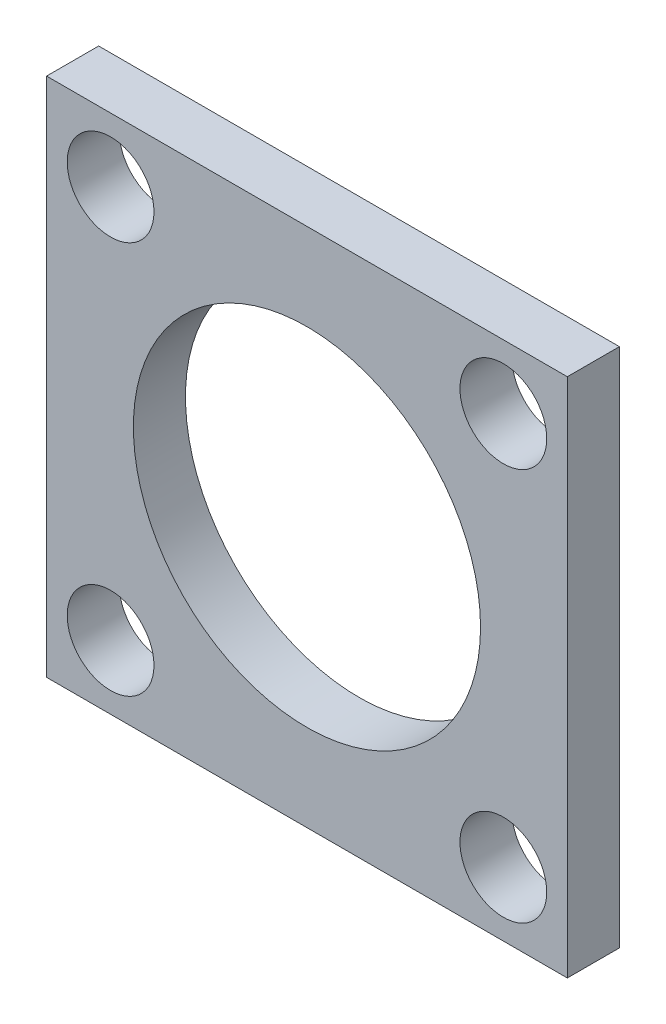
ISO-10303-21;
HEADER;
FILE_DESCRIPTION(('STEP AP214'),'2;1');
FILE_NAME('part.step','',(''),(''),'','','');
FILE_SCHEMA(('AUTOMOTIVE_DESIGN { 1 0 10303 214 1 1 1 1 }'));
ENDSEC;
DATA;
#1=APPLICATION_CONTEXT('core data for automotive mechanical design processes');
#2=APPLICATION_PROTOCOL_DEFINITION('international standard','automotive_design',2000,#1);
#3=PRODUCT_CONTEXT('',#1,'mechanical');
#4=PRODUCT('Part','Part','',(#3));
#5=PRODUCT_RELATED_PRODUCT_CATEGORY('part','',(#4));
#6=PRODUCT_DEFINITION_FORMATION('','',#4);
#7=PRODUCT_DEFINITION_CONTEXT('part definition',#1,'design');
#8=PRODUCT_DEFINITION('design','',#6,#7);
#9=PRODUCT_DEFINITION_SHAPE('','',#8);
#10=(LENGTH_UNIT() NAMED_UNIT(*) SI_UNIT(.MILLI.,.METRE.));
#11=(NAMED_UNIT(*) PLANE_ANGLE_UNIT() SI_UNIT($,.RADIAN.));
#12=(NAMED_UNIT(*) SI_UNIT($,.STERADIAN.) SOLID_ANGLE_UNIT());
#13=UNCERTAINTY_MEASURE_WITH_UNIT(LENGTH_MEASURE(1.E-05),#10,'distance_accuracy_value','');
#14=(GEOMETRIC_REPRESENTATION_CONTEXT(3) GLOBAL_UNCERTAINTY_ASSIGNED_CONTEXT((#13)) GLOBAL_UNIT_ASSIGNED_CONTEXT((#10,
#11,#12)) REPRESENTATION_CONTEXT('',''));
#15=CARTESIAN_POINT('',(0.,0.,0.));
#16=DIRECTION('',(0.,0.,1.));
#17=DIRECTION('',(1.,0.,0.));
#18=AXIS2_PLACEMENT_3D('',#15,#16,#17);
#19=CARTESIAN_POINT('',(15.,-15.,3.));
#20=DIRECTION('',(-1.,0.,0.));
#21=DIRECTION('',(0.,0.,1.));
#22=AXIS2_PLACEMENT_3D('',#19,#20,#21);
#23=PLANE('',#22);
#24=DIRECTION('',(0.,1.,0.));
#25=VECTOR('',#24,1.);
#26=CARTESIAN_POINT('',(15.,-15.,0.));
#27=LINE('',#26,#25);
#28=CARTESIAN_POINT('',(15.,-15.,0.));
#29=VERTEX_POINT('',#28);
#30=CARTESIAN_POINT('',(15.,15.,0.));
#31=VERTEX_POINT('',#30);
#32=EDGE_CURVE('E99',#29,#31,#27,.T.);
#33=ORIENTED_EDGE('',*,*,#32,.T.);
#34=DIRECTION('',(0.,0.,-1.));
#35=VECTOR('',#34,1.);
#36=CARTESIAN_POINT('',(15.,15.,3.));
#37=LINE('',#36,#35);
#38=CARTESIAN_POINT('',(15.,15.,3.));
#39=VERTEX_POINT('',#38);
#40=EDGE_CURVE('E11',#39,#31,#37,.T.);
#41=ORIENTED_EDGE('',*,*,#40,.F.);
#42=DIRECTION('',(0.,1.,0.));
#43=VECTOR('',#42,1.);
#44=CARTESIAN_POINT('',(15.,-15.,3.));
#45=LINE('',#44,#43);
#46=CARTESIAN_POINT('',(15.,-15.,3.));
#47=VERTEX_POINT('',#46);
#48=EDGE_CURVE('E86',#47,#39,#45,.T.);
#49=ORIENTED_EDGE('',*,*,#48,.F.);
#50=DIRECTION('',(0.,0.,-1.));
#51=VECTOR('',#50,1.);
#52=CARTESIAN_POINT('',(15.,-15.,3.));
#53=LINE('',#52,#51);
#54=EDGE_CURVE('E95',#47,#29,#53,.T.);
#55=ORIENTED_EDGE('',*,*,#54,.T.);
#56=EDGE_LOOP('',(#33,#41,#49,#55));
#57=FACE_BOUND('',#56,.T.);
#58=ADVANCED_FACE('F33',(#57),#23,.F.);
#59=CARTESIAN_POINT('',(-15.,15.,3.));
#60=DIRECTION('',(0.,-1.,0.));
#61=DIRECTION('',(0.,0.,-1.));
#62=AXIS2_PLACEMENT_3D('',#59,#60,#61);
#63=PLANE('',#62);
#64=DIRECTION('',(-1.,0.,0.));
#65=VECTOR('',#64,1.);
#66=CARTESIAN_POINT('',(-15.,15.,0.));
#67=LINE('',#66,#65);
#68=CARTESIAN_POINT('',(-15.,15.,0.));
#69=VERTEX_POINT('',#68);
#70=EDGE_CURVE('E90',#31,#69,#67,.T.);
#71=ORIENTED_EDGE('',*,*,#70,.T.);
#72=DIRECTION('',(0.,0.,-1.));
#73=VECTOR('',#72,1.);
#74=CARTESIAN_POINT('',(-15.,15.,3.));
#75=LINE('',#74,#73);
#76=CARTESIAN_POINT('',(-15.,15.,3.));
#77=VERTEX_POINT('',#76);
#78=EDGE_CURVE('E42',#77,#69,#75,.T.);
#79=ORIENTED_EDGE('',*,*,#78,.F.);
#80=DIRECTION('',(-1.,0.,0.));
#81=VECTOR('',#80,1.);
#82=CARTESIAN_POINT('',(-15.,15.,3.));
#83=LINE('',#82,#81);
#84=EDGE_CURVE('E81',#39,#77,#83,.T.);
#85=ORIENTED_EDGE('',*,*,#84,.F.);
#86=ORIENTED_EDGE('',*,*,#40,.T.);
#87=EDGE_LOOP('',(#71,#79,#85,#86));
#88=FACE_BOUND('',#87,.T.);
#89=ADVANCED_FACE('F89',(#88),#63,.F.);
#90=CARTESIAN_POINT('',(-15.,-15.,3.));
#91=DIRECTION('',(1.,0.,0.));
#92=DIRECTION('',(0.,0.,-1.));
#93=AXIS2_PLACEMENT_3D('',#90,#91,#92);
#94=PLANE('',#93);
#95=DIRECTION('',(0.,-1.,0.));
#96=VECTOR('',#95,1.);
#97=CARTESIAN_POINT('',(-15.,-15.,0.));
#98=LINE('',#97,#96);
#99=CARTESIAN_POINT('',(-15.,-15.,0.));
#100=VERTEX_POINT('',#99);
#101=EDGE_CURVE('E68',#69,#100,#98,.T.);
#102=ORIENTED_EDGE('',*,*,#101,.T.);
#103=DIRECTION('',(0.,0.,-1.));
#104=VECTOR('',#103,1.);
#105=CARTESIAN_POINT('',(-15.,-15.,3.));
#106=LINE('',#105,#104);
#107=CARTESIAN_POINT('',(-15.,-15.,3.));
#108=VERTEX_POINT('',#107);
#109=EDGE_CURVE('E91',#108,#100,#106,.T.);
#110=ORIENTED_EDGE('',*,*,#109,.F.);
#111=DIRECTION('',(0.,-1.,0.));
#112=VECTOR('',#111,1.);
#113=CARTESIAN_POINT('',(-15.,-15.,3.));
#114=LINE('',#113,#112);
#115=EDGE_CURVE('E84',#77,#108,#114,.T.);
#116=ORIENTED_EDGE('',*,*,#115,.F.);
#117=ORIENTED_EDGE('',*,*,#78,.T.);
#118=EDGE_LOOP('',(#102,#110,#116,#117));
#119=FACE_BOUND('',#118,.T.);
#120=ADVANCED_FACE('F93',(#119),#94,.F.);
#121=CARTESIAN_POINT('',(-15.,-15.,3.));
#122=DIRECTION('',(0.,1.,0.));
#123=DIRECTION('',(0.,0.,1.));
#124=AXIS2_PLACEMENT_3D('',#121,#122,#123);
#125=PLANE('',#124);
#126=DIRECTION('',(1.,0.,0.));
#127=VECTOR('',#126,1.);
#128=CARTESIAN_POINT('',(-15.,-15.,0.));
#129=LINE('',#128,#127);
#130=EDGE_CURVE('E74',#100,#29,#129,.T.);
#131=ORIENTED_EDGE('',*,*,#130,.T.);
#132=ORIENTED_EDGE('',*,*,#54,.F.);
#133=DIRECTION('',(1.,0.,0.));
#134=VECTOR('',#133,1.);
#135=CARTESIAN_POINT('',(-15.,-15.,3.));
#136=LINE('',#135,#134);
#137=EDGE_CURVE('E51',#108,#47,#136,.T.);
#138=ORIENTED_EDGE('',*,*,#137,.F.);
#139=ORIENTED_EDGE('',*,*,#109,.T.);
#140=EDGE_LOOP('',(#131,#132,#138,#139));
#141=FACE_BOUND('',#140,.T.);
#142=ADVANCED_FACE('F146',(#141),#125,.F.);
#143=CARTESIAN_POINT('',(0.,0.,3.));
#144=DIRECTION('',(0.,0.,-1.));
#145=DIRECTION('',(-1.,0.,0.));
#146=AXIS2_PLACEMENT_3D('',#143,#144,#145);
#147=PLANE('',#146);
#148=CARTESIAN_POINT('',(-11.3137084989841,-11.3137084989847,3.));
#149=DIRECTION('',(0.,0.,1.));
#150=DIRECTION('',(1.,0.,0.));
#151=AXIS2_PLACEMENT_3D('',#148,#149,#150);
#152=CIRCLE('',#151,2.49999999999975);
#153=CARTESIAN_POINT('',(-8.81370849898439,-11.3137084989847,3.));
#154=VERTEX_POINT('',#153);
#155=EDGE_CURVE('E132',#154,#154,#152,.T.);
#156=ORIENTED_EDGE('',*,*,#155,.F.);
#157=EDGE_LOOP('',(#156));
#158=FACE_BOUND('',#157,.T.);
#159=CARTESIAN_POINT('',(11.3137084989854,-11.3137084989841,3.));
#160=DIRECTION('',(0.,0.,1.));
#161=DIRECTION('',(1.,0.,0.));
#162=AXIS2_PLACEMENT_3D('',#159,#160,#161);
#163=CIRCLE('',#162,2.5000000000003);
#164=CARTESIAN_POINT('',(13.8137084989857,-11.3137084989841,3.));
#165=VERTEX_POINT('',#164);
#166=EDGE_CURVE('E135',#165,#165,#163,.T.);
#167=ORIENTED_EDGE('',*,*,#166,.F.);
#168=EDGE_LOOP('',(#167));
#169=FACE_BOUND('',#168,.T.);
#170=CARTESIAN_POINT('',(11.3137084989848,11.3137084989854,3.));
#171=DIRECTION('',(0.,0.,1.));
#172=DIRECTION('',(1.,0.,0.));
#173=AXIS2_PLACEMENT_3D('',#170,#171,#172);
#174=CIRCLE('',#173,2.50000000000058);
#175=CARTESIAN_POINT('',(13.8137084989854,11.3137084989854,3.));
#176=VERTEX_POINT('',#175);
#177=EDGE_CURVE('E131',#176,#176,#174,.T.);
#178=ORIENTED_EDGE('',*,*,#177,.F.);
#179=EDGE_LOOP('',(#178));
#180=FACE_BOUND('',#179,.T.);
#181=CARTESIAN_POINT('',(-11.3137084989847,11.3137084989848,3.));
#182=DIRECTION('',(0.,0.,1.));
#183=DIRECTION('',(1.,0.,0.));
#184=AXIS2_PLACEMENT_3D('',#181,#182,#183);
#185=CIRCLE('',#184,2.5);
#186=CARTESIAN_POINT('',(-8.81370849898474,11.3137084989848,3.));
#187=VERTEX_POINT('',#186);
#188=EDGE_CURVE('E112',#187,#187,#185,.T.);
#189=ORIENTED_EDGE('',*,*,#188,.F.);
#190=EDGE_LOOP('',(#189));
#191=FACE_BOUND('',#190,.T.);
#192=CARTESIAN_POINT('',(0.,0.,3.));
#193=DIRECTION('',(0.,0.,1.));
#194=DIRECTION('',(1.,0.,0.));
#195=AXIS2_PLACEMENT_3D('',#192,#193,#194);
#196=CIRCLE('',#195,10.);
#197=CARTESIAN_POINT('',(10.,0.,3.));
#198=VERTEX_POINT('',#197);
#199=EDGE_CURVE('E119',#198,#198,#196,.T.);
#200=ORIENTED_EDGE('',*,*,#199,.F.);
#201=EDGE_LOOP('',(#200));
#202=FACE_BOUND('',#201,.T.);
#203=ORIENTED_EDGE('',*,*,#48,.T.);
#204=ORIENTED_EDGE('',*,*,#84,.T.);
#205=ORIENTED_EDGE('',*,*,#115,.T.);
#206=ORIENTED_EDGE('',*,*,#137,.T.);
#207=EDGE_LOOP('',(#203,#204,#205,#206));
#208=FACE_BOUND('',#207,.T.);
#209=ADVANCED_FACE('F82',(#158,#169,#180,#191,#202,#208),#147,.F.);
#210=CARTESIAN_POINT('',(0.,0.,0.));
#211=DIRECTION('',(0.,0.,-1.));
#212=DIRECTION('',(-1.,0.,0.));
#213=AXIS2_PLACEMENT_3D('',#210,#211,#212);
#214=PLANE('',#213);
#215=CARTESIAN_POINT('',(-11.3137084989841,-11.3137084989847,0.));
#216=DIRECTION('',(0.,0.,-1.));
#217=DIRECTION('',(-1.,0.,0.));
#218=AXIS2_PLACEMENT_3D('',#215,#216,#217);
#219=CIRCLE('',#218,2.49999999999975);
#220=CARTESIAN_POINT('',(-13.8137084989839,-11.3137084989847,0.));
#221=VERTEX_POINT('',#220);
#222=EDGE_CURVE('E36',#221,#221,#219,.T.);
#223=ORIENTED_EDGE('',*,*,#222,.F.);
#224=EDGE_LOOP('',(#223));
#225=FACE_BOUND('',#224,.T.);
#226=CARTESIAN_POINT('',(11.3137084989854,-11.3137084989841,0.));
#227=DIRECTION('',(0.,0.,-1.));
#228=DIRECTION('',(-1.,0.,0.));
#229=AXIS2_PLACEMENT_3D('',#226,#227,#228);
#230=CIRCLE('',#229,2.5000000000003);
#231=CARTESIAN_POINT('',(8.81370849898509,-11.3137084989841,0.));
#232=VERTEX_POINT('',#231);
#233=EDGE_CURVE('E114',#232,#232,#230,.T.);
#234=ORIENTED_EDGE('',*,*,#233,.F.);
#235=EDGE_LOOP('',(#234));
#236=FACE_BOUND('',#235,.T.);
#237=CARTESIAN_POINT('',(11.3137084989848,11.3137084989854,0.));
#238=DIRECTION('',(0.,0.,-1.));
#239=DIRECTION('',(-1.,0.,0.));
#240=AXIS2_PLACEMENT_3D('',#237,#238,#239);
#241=CIRCLE('',#240,2.50000000000058);
#242=CARTESIAN_POINT('',(8.8137084989842,11.3137084989854,0.));
#243=VERTEX_POINT('',#242);
#244=EDGE_CURVE('E111',#243,#243,#241,.T.);
#245=ORIENTED_EDGE('',*,*,#244,.F.);
#246=EDGE_LOOP('',(#245));
#247=FACE_BOUND('',#246,.T.);
#248=CARTESIAN_POINT('',(-11.3137084989847,11.3137084989848,0.));
#249=DIRECTION('',(0.,0.,-1.));
#250=DIRECTION('',(-1.,0.,0.));
#251=AXIS2_PLACEMENT_3D('',#248,#249,#250);
#252=CIRCLE('',#251,2.5);
#253=CARTESIAN_POINT('',(-13.8137084989847,11.3137084989848,0.));
#254=VERTEX_POINT('',#253);
#255=EDGE_CURVE('E108',#254,#254,#252,.T.);
#256=ORIENTED_EDGE('',*,*,#255,.F.);
#257=EDGE_LOOP('',(#256));
#258=FACE_BOUND('',#257,.T.);
#259=CARTESIAN_POINT('',(0.,0.,0.));
#260=DIRECTION('',(0.,0.,1.));
#261=DIRECTION('',(1.,0.,0.));
#262=AXIS2_PLACEMENT_3D('',#259,#260,#261);
#263=CIRCLE('',#262,10.);
#264=CARTESIAN_POINT('',(10.,0.,0.));
#265=VERTEX_POINT('',#264);
#266=EDGE_CURVE('E102',#265,#265,#263,.T.);
#267=ORIENTED_EDGE('',*,*,#266,.T.);
#268=EDGE_LOOP('',(#267));
#269=FACE_BOUND('',#268,.T.);
#270=ORIENTED_EDGE('',*,*,#32,.F.);
#271=ORIENTED_EDGE('',*,*,#130,.F.);
#272=ORIENTED_EDGE('',*,*,#101,.F.);
#273=ORIENTED_EDGE('',*,*,#70,.F.);
#274=EDGE_LOOP('',(#270,#271,#272,#273));
#275=FACE_BOUND('',#274,.T.);
#276=ADVANCED_FACE('F145',(#225,#236,#247,#258,#269,#275),#214,.T.);
#277=CARTESIAN_POINT('',(0.,0.,0.));
#278=DIRECTION('',(0.,0.,1.));
#279=DIRECTION('',(1.,0.,0.));
#280=AXIS2_PLACEMENT_3D('',#277,#278,#279);
#281=CYLINDRICAL_SURFACE('',#280,10.);
#282=ORIENTED_EDGE('',*,*,#266,.F.);
#283=EDGE_LOOP('',(#282));
#284=FACE_BOUND('',#283,.T.);
#285=ORIENTED_EDGE('',*,*,#199,.T.);
#286=EDGE_LOOP('',(#285));
#287=FACE_BOUND('',#286,.T.);
#288=ADVANCED_FACE('F154',(#284,#287),#281,.F.);
#289=CARTESIAN_POINT('',(-11.3137084989847,11.3137084989848,-7.));
#290=DIRECTION('',(0.,0.,1.));
#291=DIRECTION('',(1.,0.,0.));
#292=AXIS2_PLACEMENT_3D('',#289,#290,#291);
#293=CYLINDRICAL_SURFACE('',#292,2.5);
#294=ORIENTED_EDGE('',*,*,#255,.T.);
#295=EDGE_LOOP('',(#294));
#296=FACE_BOUND('',#295,.T.);
#297=ORIENTED_EDGE('',*,*,#188,.T.);
#298=EDGE_LOOP('',(#297));
#299=FACE_BOUND('',#298,.T.);
#300=ADVANCED_FACE('F152',(#296,#299),#293,.F.);
#301=CARTESIAN_POINT('',(11.3137084989848,11.3137084989854,-7.));
#302=DIRECTION('',(0.,0.,1.));
#303=DIRECTION('',(1.,0.,0.));
#304=AXIS2_PLACEMENT_3D('',#301,#302,#303);
#305=CYLINDRICAL_SURFACE('',#304,2.50000000000058);
#306=ORIENTED_EDGE('',*,*,#244,.T.);
#307=EDGE_LOOP('',(#306));
#308=FACE_BOUND('',#307,.T.);
#309=ORIENTED_EDGE('',*,*,#177,.T.);
#310=EDGE_LOOP('',(#309));
#311=FACE_BOUND('',#310,.T.);
#312=ADVANCED_FACE('F141',(#308,#311),#305,.F.);
#313=CARTESIAN_POINT('',(11.3137084989854,-11.3137084989841,-7.));
#314=DIRECTION('',(0.,0.,1.));
#315=DIRECTION('',(1.,0.,0.));
#316=AXIS2_PLACEMENT_3D('',#313,#314,#315);
#317=CYLINDRICAL_SURFACE('',#316,2.5000000000003);
#318=ORIENTED_EDGE('',*,*,#233,.T.);
#319=EDGE_LOOP('',(#318));
#320=FACE_BOUND('',#319,.T.);
#321=ORIENTED_EDGE('',*,*,#166,.T.);
#322=EDGE_LOOP('',(#321));
#323=FACE_BOUND('',#322,.T.);
#324=ADVANCED_FACE('F161',(#320,#323),#317,.F.);
#325=CARTESIAN_POINT('',(-11.3137084989841,-11.3137084989847,-7.));
#326=DIRECTION('',(0.,0.,1.));
#327=DIRECTION('',(1.,0.,0.));
#328=AXIS2_PLACEMENT_3D('',#325,#326,#327);
#329=CYLINDRICAL_SURFACE('',#328,2.49999999999975);
#330=ORIENTED_EDGE('',*,*,#222,.T.);
#331=EDGE_LOOP('',(#330));
#332=FACE_BOUND('',#331,.T.);
#333=ORIENTED_EDGE('',*,*,#155,.T.);
#334=EDGE_LOOP('',(#333));
#335=FACE_BOUND('',#334,.T.);
#336=ADVANCED_FACE('F222',(#332,#335),#329,.F.);
#337=CLOSED_SHELL('',(#58,#89,#120,#142,#209,#276,#288,#300,#312,#324,#336));
#338=MANIFOLD_SOLID_BREP('B2',#337);
#339=ADVANCED_BREP_SHAPE_REPRESENTATION('',(#18,#338),#14);
#340=SHAPE_DEFINITION_REPRESENTATION(#9,#339);
ENDSEC;
END-ISO-10303-21;
